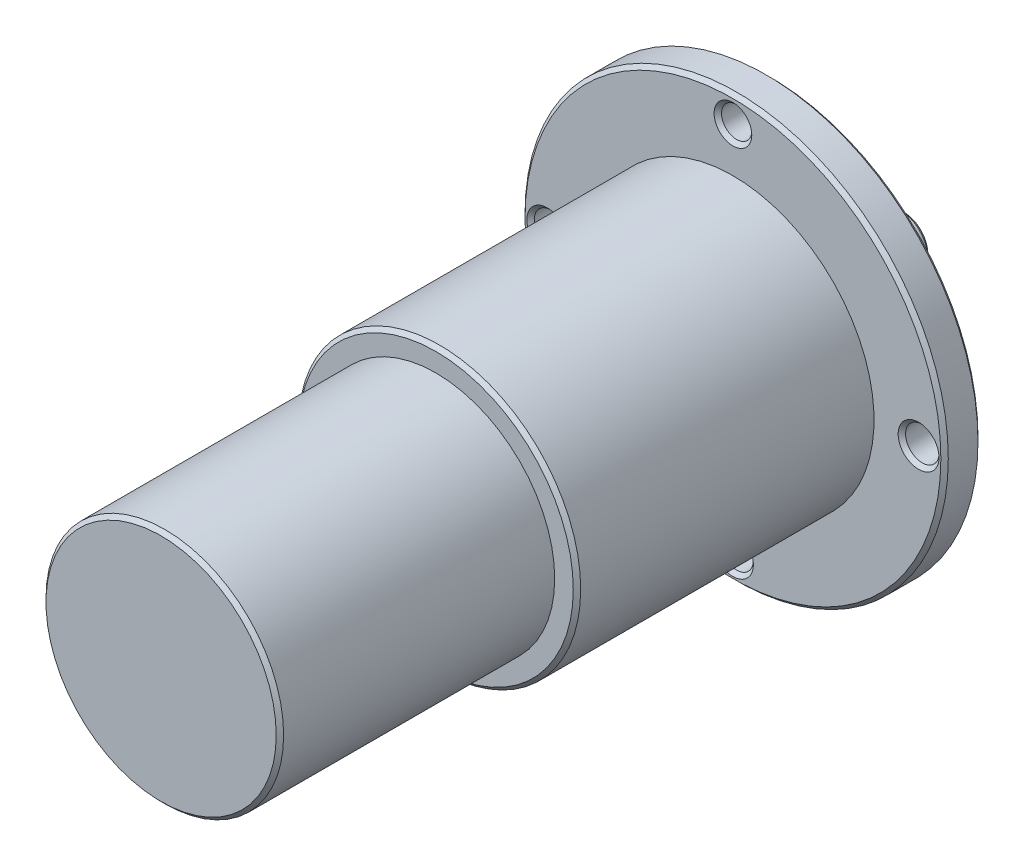
ISO-10303-21;
HEADER;
FILE_DESCRIPTION(('STEP AP214'),'2;1');
FILE_NAME('part.step','',(''),(''),'','','');
FILE_SCHEMA(('AUTOMOTIVE_DESIGN { 1 0 10303 214 1 1 1 1 }'));
ENDSEC;
DATA;
#1=APPLICATION_CONTEXT('core data for automotive mechanical design processes');
#2=APPLICATION_PROTOCOL_DEFINITION('international standard','automotive_design',2000,#1);
#3=PRODUCT_CONTEXT('',#1,'mechanical');
#4=PRODUCT('Part','Part','',(#3));
#5=PRODUCT_RELATED_PRODUCT_CATEGORY('part','',(#4));
#6=PRODUCT_DEFINITION_FORMATION('','',#4);
#7=PRODUCT_DEFINITION_CONTEXT('part definition',#1,'design');
#8=PRODUCT_DEFINITION('design','',#6,#7);
#9=PRODUCT_DEFINITION_SHAPE('','',#8);
#10=(LENGTH_UNIT() NAMED_UNIT(*) SI_UNIT(.MILLI.,.METRE.));
#11=(NAMED_UNIT(*) PLANE_ANGLE_UNIT() SI_UNIT($,.RADIAN.));
#12=(NAMED_UNIT(*) SI_UNIT($,.STERADIAN.) SOLID_ANGLE_UNIT());
#13=UNCERTAINTY_MEASURE_WITH_UNIT(LENGTH_MEASURE(1.E-05),#10,'distance_accuracy_value','');
#14=(GEOMETRIC_REPRESENTATION_CONTEXT(3) GLOBAL_UNCERTAINTY_ASSIGNED_CONTEXT((#13)) GLOBAL_UNIT_ASSIGNED_CONTEXT((#10,
#11,#12)) REPRESENTATION_CONTEXT('',''));
#15=CARTESIAN_POINT('',(0.,0.,0.));
#16=DIRECTION('',(0.,0.,1.));
#17=DIRECTION('',(1.,0.,0.));
#18=AXIS2_PLACEMENT_3D('',#15,#16,#17);
#19=CARTESIAN_POINT('',(-45.626724137931,0.,75.3655172413793));
#20=DIRECTION('',(0.,0.,1.));
#21=DIRECTION('',(1.,0.,0.));
#22=AXIS2_PLACEMENT_3D('',#19,#20,#21);
#23=PLANE('',#22);
#24=CARTESIAN_POINT('',(-29.626724137931,0.,75.3655172413793));
#25=DIRECTION('',(0.,0.,1.));
#26=DIRECTION('',(1.,0.,0.));
#27=AXIS2_PLACEMENT_3D('',#24,#25,#26);
#28=CIRCLE('',#27,15.5);
#29=CARTESIAN_POINT('',(-14.126724137931,0.,75.3655172413793));
#30=VERTEX_POINT('',#29);
#31=EDGE_CURVE('E40',#30,#30,#28,.T.);
#32=ORIENTED_EDGE('',*,*,#31,.T.);
#33=EDGE_LOOP('',(#32));
#34=FACE_BOUND('',#33,.T.);
#35=ADVANCED_FACE('F29',(#34),#23,.T.);
#36=CARTESIAN_POINT('',(-29.626724137931,0.,-29.8531609195402));
#37=DIRECTION('',(0.,0.,-1.));
#38=DIRECTION('',(-1.,0.,0.));
#39=AXIS2_PLACEMENT_3D('',#36,#37,#38);
#40=CYLINDRICAL_SURFACE('',#39,16.);
#41=CARTESIAN_POINT('',(-29.626724137931,0.,74.8655172413793));
#42=DIRECTION('',(0.,0.,1.));
#43=DIRECTION('',(1.,0.,0.));
#44=AXIS2_PLACEMENT_3D('',#41,#42,#43);
#45=CIRCLE('',#44,16.);
#46=CARTESIAN_POINT('',(-13.626724137931,0.,74.8655172413793));
#47=VERTEX_POINT('',#46);
#48=EDGE_CURVE('E44',#47,#47,#45,.F.);
#49=ORIENTED_EDGE('',*,*,#48,.T.);
#50=EDGE_LOOP('',(#49));
#51=FACE_BOUND('',#50,.T.);
#52=CARTESIAN_POINT('',(-29.626724137931,0.,38.3655172413793));
#53=DIRECTION('',(0.,0.,-1.));
#54=DIRECTION('',(-1.,0.,0.));
#55=AXIS2_PLACEMENT_3D('',#52,#53,#54);
#56=CIRCLE('',#55,16.);
#57=CARTESIAN_POINT('',(-45.626724137931,0.,38.3655172413793));
#58=VERTEX_POINT('',#57);
#59=EDGE_CURVE('E121',#58,#58,#56,.T.);
#60=ORIENTED_EDGE('',*,*,#59,.F.);
#61=EDGE_LOOP('',(#60));
#62=FACE_BOUND('',#61,.T.);
#63=ADVANCED_FACE('F152',(#51,#62),#40,.T.);
#64=CARTESIAN_POINT('',(-48.626724137931,0.,38.3655172413793));
#65=DIRECTION('',(0.,0.,1.));
#66=DIRECTION('',(1.,0.,0.));
#67=AXIS2_PLACEMENT_3D('',#64,#65,#66);
#68=PLANE('',#67);
#69=CARTESIAN_POINT('',(-29.626724137931,0.,38.3655172413793));
#70=DIRECTION('',(0.,0.,1.));
#71=DIRECTION('',(1.,0.,0.));
#72=AXIS2_PLACEMENT_3D('',#69,#70,#71);
#73=CIRCLE('',#72,18.5);
#74=CARTESIAN_POINT('',(-11.126724137931,0.,38.3655172413793));
#75=VERTEX_POINT('',#74);
#76=EDGE_CURVE('E10',#75,#75,#73,.T.);
#77=ORIENTED_EDGE('',*,*,#76,.T.);
#78=EDGE_LOOP('',(#77));
#79=FACE_BOUND('',#78,.T.);
#80=ORIENTED_EDGE('',*,*,#59,.T.);
#81=EDGE_LOOP('',(#80));
#82=FACE_BOUND('',#81,.T.);
#83=ADVANCED_FACE('F158',(#79,#82),#68,.T.);
#84=CARTESIAN_POINT('',(-29.626724137931,0.,-29.8531609195402));
#85=DIRECTION('',(0.,0.,-1.));
#86=DIRECTION('',(-1.,0.,0.));
#87=AXIS2_PLACEMENT_3D('',#84,#85,#86);
#88=CYLINDRICAL_SURFACE('',#87,19.);
#89=CARTESIAN_POINT('',(-29.626724137931,0.,37.8655172413793));
#90=DIRECTION('',(0.,0.,1.));
#91=DIRECTION('',(1.,0.,0.));
#92=AXIS2_PLACEMENT_3D('',#89,#90,#91);
#93=CIRCLE('',#92,19.);
#94=CARTESIAN_POINT('',(-10.626724137931,0.,37.8655172413793));
#95=VERTEX_POINT('',#94);
#96=EDGE_CURVE('E36',#95,#95,#93,.F.);
#97=ORIENTED_EDGE('',*,*,#96,.T.);
#98=EDGE_LOOP('',(#97));
#99=FACE_BOUND('',#98,.T.);
#100=CARTESIAN_POINT('',(-29.626724137931,0.,-1.63448275862068));
#101=DIRECTION('',(0.,0.,-1.));
#102=DIRECTION('',(-1.,0.,0.));
#103=AXIS2_PLACEMENT_3D('',#100,#101,#102);
#104=CIRCLE('',#103,19.);
#105=CARTESIAN_POINT('',(-48.626724137931,0.,-1.63448275862068));
#106=VERTEX_POINT('',#105);
#107=EDGE_CURVE('E124',#106,#106,#104,.T.);
#108=ORIENTED_EDGE('',*,*,#107,.F.);
#109=EDGE_LOOP('',(#108));
#110=FACE_BOUND('',#109,.T.);
#111=ADVANCED_FACE('F225',(#99,#110),#88,.T.);
#112=CARTESIAN_POINT('',(-58.126724137931,0.,-1.63448275862068));
#113=DIRECTION('',(0.,0.,1.));
#114=DIRECTION('',(1.,0.,0.));
#115=AXIS2_PLACEMENT_3D('',#112,#113,#114);
#116=PLANE('',#115);
#117=CARTESIAN_POINT('',(-54.626724137931,0.,-1.63448275862068));
#118=DIRECTION('',(0.,0.,1.));
#119=DIRECTION('',(1.,0.,0.));
#120=AXIS2_PLACEMENT_3D('',#117,#118,#119);
#121=CIRCLE('',#120,2.74999999999999);
#122=CARTESIAN_POINT('',(-51.876724137931,0.,-1.63448275862068));
#123=VERTEX_POINT('',#122);
#124=EDGE_CURVE('E100',#123,#123,#121,.F.);
#125=ORIENTED_EDGE('',*,*,#124,.T.);
#126=EDGE_LOOP('',(#125));
#127=FACE_BOUND('',#126,.T.);
#128=CARTESIAN_POINT('',(-4.62672413793103,0.,-1.63448275862068));
#129=DIRECTION('',(0.,0.,1.));
#130=DIRECTION('',(1.,0.,0.));
#131=AXIS2_PLACEMENT_3D('',#128,#129,#130);
#132=CIRCLE('',#131,2.74999999999999);
#133=CARTESIAN_POINT('',(-1.87672413793104,0.,-1.63448275862068));
#134=VERTEX_POINT('',#133);
#135=EDGE_CURVE('E103',#134,#134,#132,.F.);
#136=ORIENTED_EDGE('',*,*,#135,.T.);
#137=EDGE_LOOP('',(#136));
#138=FACE_BOUND('',#137,.T.);
#139=CARTESIAN_POINT('',(-29.626724137931,25.,-1.63448275862068));
#140=DIRECTION('',(0.,0.,1.));
#141=DIRECTION('',(1.,0.,0.));
#142=AXIS2_PLACEMENT_3D('',#139,#140,#141);
#143=CIRCLE('',#142,2.53684922244777);
#144=CARTESIAN_POINT('',(-27.0898749154833,25.,-1.63448275862068));
#145=VERTEX_POINT('',#144);
#146=EDGE_CURVE('E106',#145,#145,#143,.F.);
#147=ORIENTED_EDGE('',*,*,#146,.T.);
#148=EDGE_LOOP('',(#147));
#149=FACE_BOUND('',#148,.T.);
#150=CARTESIAN_POINT('',(-29.626724137931,-25.,-1.63448275862068));
#151=DIRECTION('',(0.,0.,1.));
#152=DIRECTION('',(1.,0.,0.));
#153=AXIS2_PLACEMENT_3D('',#150,#151,#152);
#154=CIRCLE('',#153,2.74999999999998);
#155=CARTESIAN_POINT('',(-26.876724137931,-25.,-1.63448275862068));
#156=VERTEX_POINT('',#155);
#157=EDGE_CURVE('E109',#156,#156,#154,.F.);
#158=ORIENTED_EDGE('',*,*,#157,.T.);
#159=EDGE_LOOP('',(#158));
#160=FACE_BOUND('',#159,.T.);
#161=CARTESIAN_POINT('',(-29.626724137931,0.,-1.63448275862068));
#162=DIRECTION('',(0.,0.,1.));
#163=DIRECTION('',(1.,0.,0.));
#164=AXIS2_PLACEMENT_3D('',#161,#162,#163);
#165=CIRCLE('',#164,28.);
#166=CARTESIAN_POINT('',(-1.62672413793104,0.,-1.63448275862068));
#167=VERTEX_POINT('',#166);
#168=EDGE_CURVE('E112',#167,#167,#165,.T.);
#169=ORIENTED_EDGE('',*,*,#168,.T.);
#170=EDGE_LOOP('',(#169));
#171=FACE_BOUND('',#170,.T.);
#172=ORIENTED_EDGE('',*,*,#107,.T.);
#173=EDGE_LOOP('',(#172));
#174=FACE_BOUND('',#173,.T.);
#175=ADVANCED_FACE('F229',(#127,#138,#149,#160,#171,#174),#116,.T.);
#176=CARTESIAN_POINT('',(-29.626724137931,0.,-29.8531609195402));
#177=DIRECTION('',(0.,0.,-1.));
#178=DIRECTION('',(-1.,0.,0.));
#179=AXIS2_PLACEMENT_3D('',#176,#177,#178);
#180=CYLINDRICAL_SURFACE('',#179,28.5);
#181=CARTESIAN_POINT('',(-29.626724137931,0.,-6.13448275862067));
#182=DIRECTION('',(0.,0.,-1.));
#183=DIRECTION('',(-1.,0.,0.));
#184=AXIS2_PLACEMENT_3D('',#181,#182,#183);
#185=CIRCLE('',#184,28.5);
#186=CARTESIAN_POINT('',(-58.126724137931,0.,-6.13448275862067));
#187=VERTEX_POINT('',#186);
#188=EDGE_CURVE('E49',#187,#187,#185,.F.);
#189=ORIENTED_EDGE('',*,*,#188,.T.);
#190=EDGE_LOOP('',(#189));
#191=FACE_BOUND('',#190,.T.);
#192=CARTESIAN_POINT('',(-29.626724137931,0.,-2.13448275862068));
#193=DIRECTION('',(0.,0.,1.));
#194=DIRECTION('',(1.,0.,0.));
#195=AXIS2_PLACEMENT_3D('',#192,#193,#194);
#196=CIRCLE('',#195,28.5);
#197=CARTESIAN_POINT('',(-1.12672413793103,0.,-2.13448275862068));
#198=VERTEX_POINT('',#197);
#199=EDGE_CURVE('E52',#198,#198,#196,.F.);
#200=ORIENTED_EDGE('',*,*,#199,.T.);
#201=EDGE_LOOP('',(#200));
#202=FACE_BOUND('',#201,.T.);
#203=ADVANCED_FACE('F234',(#191,#202),#180,.T.);
#204=CARTESIAN_POINT('',(-42.126724137931,0.,-6.63448275862068));
#205=DIRECTION('',(0.,0.,-1.));
#206=DIRECTION('',(-1.,0.,0.));
#207=AXIS2_PLACEMENT_3D('',#204,#205,#206);
#208=PLANE('',#207);
#209=CARTESIAN_POINT('',(-29.626724137931,25.,-6.63448275862068));
#210=DIRECTION('',(0.,0.,-1.));
#211=DIRECTION('',(-1.,0.,0.));
#212=AXIS2_PLACEMENT_3D('',#209,#210,#211);
#213=CIRCLE('',#212,2.53684922244778);
#214=CARTESIAN_POINT('',(-32.1635733603788,25.,-6.63448275862068));
#215=VERTEX_POINT('',#214);
#216=EDGE_CURVE('E67',#215,#215,#213,.F.);
#217=ORIENTED_EDGE('',*,*,#216,.T.);
#218=EDGE_LOOP('',(#217));
#219=FACE_BOUND('',#218,.T.);
#220=CARTESIAN_POINT('',(-4.62672413793103,0.,-6.63448275862068));
#221=DIRECTION('',(0.,0.,-1.));
#222=DIRECTION('',(-1.,0.,0.));
#223=AXIS2_PLACEMENT_3D('',#220,#221,#222);
#224=CIRCLE('',#223,2.74999999999999);
#225=CARTESIAN_POINT('',(-7.37672413793102,0.,-6.63448275862068));
#226=VERTEX_POINT('',#225);
#227=EDGE_CURVE('E70',#226,#226,#224,.F.);
#228=ORIENTED_EDGE('',*,*,#227,.T.);
#229=EDGE_LOOP('',(#228));
#230=FACE_BOUND('',#229,.T.);
#231=CARTESIAN_POINT('',(-29.626724137931,-25.,-6.63448275862068));
#232=DIRECTION('',(0.,0.,-1.));
#233=DIRECTION('',(-1.,0.,0.));
#234=AXIS2_PLACEMENT_3D('',#231,#232,#233);
#235=CIRCLE('',#234,2.74999999999999);
#236=CARTESIAN_POINT('',(-32.376724137931,-25.,-6.63448275862068));
#237=VERTEX_POINT('',#236);
#238=EDGE_CURVE('E73',#237,#237,#235,.F.);
#239=ORIENTED_EDGE('',*,*,#238,.T.);
#240=EDGE_LOOP('',(#239));
#241=FACE_BOUND('',#240,.T.);
#242=CARTESIAN_POINT('',(-54.626724137931,0.,-6.63448275862068));
#243=DIRECTION('',(0.,0.,-1.));
#244=DIRECTION('',(-1.,0.,0.));
#245=AXIS2_PLACEMENT_3D('',#242,#243,#244);
#246=CIRCLE('',#245,2.74999999999999);
#247=CARTESIAN_POINT('',(-57.376724137931,0.,-6.63448275862068));
#248=VERTEX_POINT('',#247);
#249=EDGE_CURVE('E76',#248,#248,#246,.F.);
#250=ORIENTED_EDGE('',*,*,#249,.T.);
#251=EDGE_LOOP('',(#250));
#252=FACE_BOUND('',#251,.T.);
#253=CARTESIAN_POINT('',(-29.626724137931,0.,-6.63448275862068));
#254=DIRECTION('',(0.,0.,-1.));
#255=DIRECTION('',(-1.,0.,0.));
#256=AXIS2_PLACEMENT_3D('',#253,#254,#255);
#257=CIRCLE('',#256,28.);
#258=CARTESIAN_POINT('',(-57.626724137931,0.,-6.63448275862068));
#259=VERTEX_POINT('',#258);
#260=EDGE_CURVE('E79',#259,#259,#257,.T.);
#261=ORIENTED_EDGE('',*,*,#260,.T.);
#262=EDGE_LOOP('',(#261));
#263=FACE_BOUND('',#262,.T.);
#264=CARTESIAN_POINT('',(-29.626724137931,0.,-6.63448275862068));
#265=DIRECTION('',(0.,0.,-1.));
#266=DIRECTION('',(-1.,0.,0.));
#267=AXIS2_PLACEMENT_3D('',#264,#265,#266);
#268=CIRCLE('',#267,12.5);
#269=CARTESIAN_POINT('',(-42.126724137931,0.,-6.63448275862068));
#270=VERTEX_POINT('',#269);
#271=EDGE_CURVE('E127',#270,#270,#268,.T.);
#272=ORIENTED_EDGE('',*,*,#271,.F.);
#273=EDGE_LOOP('',(#272));
#274=FACE_BOUND('',#273,.T.);
#275=ADVANCED_FACE('F148',(#219,#230,#241,#252,#263,#274),#208,.T.);
#276=CARTESIAN_POINT('',(-29.626724137931,0.,-29.8531609195402));
#277=DIRECTION('',(0.,0.,-1.));
#278=DIRECTION('',(-1.,0.,0.));
#279=AXIS2_PLACEMENT_3D('',#276,#277,#278);
#280=CYLINDRICAL_SURFACE('',#279,12.5);
#281=CARTESIAN_POINT('',(-29.626724137931,0.,-9.13448275862069));
#282=DIRECTION('',(0.,0.,-1.));
#283=DIRECTION('',(-1.,0.,0.));
#284=AXIS2_PLACEMENT_3D('',#281,#282,#283);
#285=CIRCLE('',#284,12.5);
#286=CARTESIAN_POINT('',(-42.126724137931,0.,-9.13448275862069));
#287=VERTEX_POINT('',#286);
#288=EDGE_CURVE('E61',#287,#287,#285,.F.);
#289=ORIENTED_EDGE('',*,*,#288,.T.);
#290=EDGE_LOOP('',(#289));
#291=FACE_BOUND('',#290,.T.);
#292=ORIENTED_EDGE('',*,*,#271,.T.);
#293=EDGE_LOOP('',(#292));
#294=FACE_BOUND('',#293,.T.);
#295=ADVANCED_FACE('F138',(#291,#294),#280,.T.);
#296=CARTESIAN_POINT('',(-33.376724137931,0.,-9.63448275862068));
#297=DIRECTION('',(0.,0.,-1.));
#298=DIRECTION('',(-1.,0.,0.));
#299=AXIS2_PLACEMENT_3D('',#296,#297,#298);
#300=PLANE('',#299);
#301=CARTESIAN_POINT('',(-29.626724137931,0.,-9.63448275862068));
#302=DIRECTION('',(0.,0.,-1.));
#303=DIRECTION('',(-1.,0.,0.));
#304=AXIS2_PLACEMENT_3D('',#301,#302,#303);
#305=CIRCLE('',#304,12.);
#306=CARTESIAN_POINT('',(-41.626724137931,0.,-9.63448275862068));
#307=VERTEX_POINT('',#306);
#308=EDGE_CURVE('E64',#307,#307,#305,.T.);
#309=ORIENTED_EDGE('',*,*,#308,.T.);
#310=EDGE_LOOP('',(#309));
#311=FACE_BOUND('',#310,.T.);
#312=CARTESIAN_POINT('',(-29.626724137931,0.,-9.63448275862068));
#313=DIRECTION('',(0.,0.,-1.));
#314=DIRECTION('',(-1.,0.,0.));
#315=AXIS2_PLACEMENT_3D('',#312,#313,#314);
#316=CIRCLE('',#315,3.75000000000001);
#317=CARTESIAN_POINT('',(-33.376724137931,0.,-9.63448275862068));
#318=VERTEX_POINT('',#317);
#319=EDGE_CURVE('E130',#318,#318,#316,.T.);
#320=ORIENTED_EDGE('',*,*,#319,.F.);
#321=EDGE_LOOP('',(#320));
#322=FACE_BOUND('',#321,.T.);
#323=ADVANCED_FACE('F136',(#311,#322),#300,.T.);
#324=CARTESIAN_POINT('',(-29.626724137931,0.,-29.8531609195402));
#325=DIRECTION('',(0.,0.,-1.));
#326=DIRECTION('',(-1.,0.,0.));
#327=AXIS2_PLACEMENT_3D('',#324,#325,#326);
#328=CYLINDRICAL_SURFACE('',#327,3.75000000000001);
#329=CARTESIAN_POINT('',(-29.626724137931,0.,-24.1344827586207));
#330=DIRECTION('',(0.,0.,-1.));
#331=DIRECTION('',(-1.,0.,0.));
#332=AXIS2_PLACEMENT_3D('',#329,#330,#331);
#333=CIRCLE('',#332,3.75000000000001);
#334=CARTESIAN_POINT('',(-33.376724137931,0.,-24.1344827586207));
#335=VERTEX_POINT('',#334);
#336=EDGE_CURVE('E55',#335,#335,#333,.F.);
#337=ORIENTED_EDGE('',*,*,#336,.T.);
#338=EDGE_LOOP('',(#337));
#339=FACE_BOUND('',#338,.T.);
#340=ORIENTED_EDGE('',*,*,#319,.T.);
#341=EDGE_LOOP('',(#340));
#342=FACE_BOUND('',#341,.T.);
#343=ADVANCED_FACE('F134',(#339,#342),#328,.T.);
#344=CARTESIAN_POINT('',(-29.626724137931,0.,-24.6344827586207));
#345=DIRECTION('',(0.,0.,-1.));
#346=DIRECTION('',(-1.,0.,0.));
#347=AXIS2_PLACEMENT_3D('',#344,#345,#346);
#348=PLANE('',#347);
#349=CARTESIAN_POINT('',(-29.626724137931,0.,-24.6344827586207));
#350=DIRECTION('',(0.,0.,-1.));
#351=DIRECTION('',(-1.,0.,0.));
#352=AXIS2_PLACEMENT_3D('',#349,#350,#351);
#353=CIRCLE('',#352,3.25000000000003);
#354=CARTESIAN_POINT('',(-32.8767241379311,0.,-24.6344827586207));
#355=VERTEX_POINT('',#354);
#356=EDGE_CURVE('E58',#355,#355,#353,.T.);
#357=ORIENTED_EDGE('',*,*,#356,.T.);
#358=EDGE_LOOP('',(#357));
#359=FACE_BOUND('',#358,.T.);
#360=ADVANCED_FACE('F145',(#359),#348,.T.);
#361=CARTESIAN_POINT('',(-4.62672413793103,0.,-11.6344827586207));
#362=DIRECTION('',(0.,0.,1.));
#363=DIRECTION('',(1.,0.,0.));
#364=AXIS2_PLACEMENT_3D('',#361,#362,#363);
#365=CYLINDRICAL_SURFACE('',#364,2.25);
#366=CARTESIAN_POINT('',(-4.62672413793103,0.,-2.13448275862066));
#367=DIRECTION('',(0.,0.,1.));
#368=DIRECTION('',(1.,0.,0.));
#369=AXIS2_PLACEMENT_3D('',#366,#367,#368);
#370=CIRCLE('',#369,2.25);
#371=CARTESIAN_POINT('',(-2.37672413793103,0.,-2.13448275862066));
#372=VERTEX_POINT('',#371);
#373=EDGE_CURVE('E94',#372,#372,#370,.T.);
#374=ORIENTED_EDGE('',*,*,#373,.T.);
#375=EDGE_LOOP('',(#374));
#376=FACE_BOUND('',#375,.T.);
#377=CARTESIAN_POINT('',(-4.62672413793103,0.,-6.1344827586207));
#378=DIRECTION('',(0.,0.,-1.));
#379=DIRECTION('',(-1.,0.,0.));
#380=AXIS2_PLACEMENT_3D('',#377,#378,#379);
#381=CIRCLE('',#380,2.25);
#382=CARTESIAN_POINT('',(-6.87672413793103,0.,-6.1344827586207));
#383=VERTEX_POINT('',#382);
#384=EDGE_CURVE('E97',#383,#383,#381,.T.);
#385=ORIENTED_EDGE('',*,*,#384,.T.);
#386=EDGE_LOOP('',(#385));
#387=FACE_BOUND('',#386,.T.);
#388=ADVANCED_FACE('F270',(#376,#387),#365,.F.);
#389=CARTESIAN_POINT('',(-29.626724137931,25.,-11.6344827586207));
#390=DIRECTION('',(0.,0.,1.));
#391=DIRECTION('',(1.,0.,0.));
#392=AXIS2_PLACEMENT_3D('',#389,#390,#391);
#393=CYLINDRICAL_SURFACE('',#392,2.03684922244779);
#394=CARTESIAN_POINT('',(-29.626724137931,25.,-2.13448275862067));
#395=DIRECTION('',(0.,0.,1.));
#396=DIRECTION('',(1.,0.,0.));
#397=AXIS2_PLACEMENT_3D('',#394,#395,#396);
#398=CIRCLE('',#397,2.03684922244779);
#399=CARTESIAN_POINT('',(-27.5898749154832,25.,-2.13448275862067));
#400=VERTEX_POINT('',#399);
#401=EDGE_CURVE('E88',#400,#400,#398,.T.);
#402=ORIENTED_EDGE('',*,*,#401,.T.);
#403=EDGE_LOOP('',(#402));
#404=FACE_BOUND('',#403,.T.);
#405=CARTESIAN_POINT('',(-29.626724137931,25.,-6.13448275862068));
#406=DIRECTION('',(0.,0.,-1.));
#407=DIRECTION('',(-1.,0.,0.));
#408=AXIS2_PLACEMENT_3D('',#405,#406,#407);
#409=CIRCLE('',#408,2.03684922244779);
#410=CARTESIAN_POINT('',(-31.6635733603788,25.,-6.13448275862068));
#411=VERTEX_POINT('',#410);
#412=EDGE_CURVE('E91',#411,#411,#409,.T.);
#413=ORIENTED_EDGE('',*,*,#412,.T.);
#414=EDGE_LOOP('',(#413));
#415=FACE_BOUND('',#414,.T.);
#416=ADVANCED_FACE('F261',(#404,#415),#393,.F.);
#417=CARTESIAN_POINT('',(-54.626724137931,0.,-11.6344827586207));
#418=DIRECTION('',(0.,0.,1.));
#419=DIRECTION('',(1.,0.,0.));
#420=AXIS2_PLACEMENT_3D('',#417,#418,#419);
#421=CYLINDRICAL_SURFACE('',#420,2.25);
#422=CARTESIAN_POINT('',(-54.626724137931,0.,-2.13448275862066));
#423=DIRECTION('',(0.,0.,1.));
#424=DIRECTION('',(1.,0.,0.));
#425=AXIS2_PLACEMENT_3D('',#422,#423,#424);
#426=CIRCLE('',#425,2.25);
#427=CARTESIAN_POINT('',(-52.376724137931,0.,-2.13448275862066));
#428=VERTEX_POINT('',#427);
#429=EDGE_CURVE('E115',#428,#428,#426,.T.);
#430=ORIENTED_EDGE('',*,*,#429,.T.);
#431=EDGE_LOOP('',(#430));
#432=FACE_BOUND('',#431,.T.);
#433=CARTESIAN_POINT('',(-54.626724137931,0.,-6.1344827586207));
#434=DIRECTION('',(0.,0.,-1.));
#435=DIRECTION('',(-1.,0.,0.));
#436=AXIS2_PLACEMENT_3D('',#433,#434,#435);
#437=CIRCLE('',#436,2.25);
#438=CARTESIAN_POINT('',(-56.876724137931,0.,-6.1344827586207));
#439=VERTEX_POINT('',#438);
#440=EDGE_CURVE('E118',#439,#439,#437,.T.);
#441=ORIENTED_EDGE('',*,*,#440,.T.);
#442=EDGE_LOOP('',(#441));
#443=FACE_BOUND('',#442,.T.);
#444=ADVANCED_FACE('F259',(#432,#443),#421,.F.);
#445=CARTESIAN_POINT('',(-29.626724137931,-25.,-11.6344827586207));
#446=DIRECTION('',(0.,0.,1.));
#447=DIRECTION('',(1.,0.,0.));
#448=AXIS2_PLACEMENT_3D('',#445,#446,#447);
#449=CYLINDRICAL_SURFACE('',#448,2.25);
#450=CARTESIAN_POINT('',(-29.626724137931,-25.,-2.13448275862066));
#451=DIRECTION('',(0.,0.,1.));
#452=DIRECTION('',(1.,0.,0.));
#453=AXIS2_PLACEMENT_3D('',#450,#451,#452);
#454=CIRCLE('',#453,2.25);
#455=CARTESIAN_POINT('',(-27.376724137931,-25.,-2.13448275862066));
#456=VERTEX_POINT('',#455);
#457=EDGE_CURVE('E82',#456,#456,#454,.T.);
#458=ORIENTED_EDGE('',*,*,#457,.T.);
#459=EDGE_LOOP('',(#458));
#460=FACE_BOUND('',#459,.T.);
#461=CARTESIAN_POINT('',(-29.626724137931,-25.,-6.13448275862069));
#462=DIRECTION('',(0.,0.,-1.));
#463=DIRECTION('',(-1.,0.,0.));
#464=AXIS2_PLACEMENT_3D('',#461,#462,#463);
#465=CIRCLE('',#464,2.25);
#466=CARTESIAN_POINT('',(-31.876724137931,-25.,-6.13448275862069));
#467=VERTEX_POINT('',#466);
#468=EDGE_CURVE('E85',#467,#467,#465,.T.);
#469=ORIENTED_EDGE('',*,*,#468,.T.);
#470=EDGE_LOOP('',(#469));
#471=FACE_BOUND('',#470,.T.);
#472=ADVANCED_FACE('F167',(#460,#471),#449,.F.);
#473=CARTESIAN_POINT('',(-54.626724137931,0.,-2.13448275862066));
#474=DIRECTION('',(0.,0.,1.));
#475=DIRECTION('',(1.,0.,0.));
#476=AXIS2_PLACEMENT_3D('',#473,#474,#475);
#477=CONICAL_SURFACE('',#476,2.25,0.785398163397455);
#478=ORIENTED_EDGE('',*,*,#124,.F.);
#479=EDGE_LOOP('',(#478));
#480=FACE_BOUND('',#479,.T.);
#481=ORIENTED_EDGE('',*,*,#429,.F.);
#482=EDGE_LOOP('',(#481));
#483=FACE_BOUND('',#482,.T.);
#484=ADVANCED_FACE('F163',(#480,#483),#477,.F.);
#485=CARTESIAN_POINT('',(-4.62672413793103,0.,-2.13448275862066));
#486=DIRECTION('',(0.,0.,1.));
#487=DIRECTION('',(1.,0.,0.));
#488=AXIS2_PLACEMENT_3D('',#485,#486,#487);
#489=CONICAL_SURFACE('',#488,2.25,0.785398163397454);
#490=ORIENTED_EDGE('',*,*,#135,.F.);
#491=EDGE_LOOP('',(#490));
#492=FACE_BOUND('',#491,.T.);
#493=ORIENTED_EDGE('',*,*,#373,.F.);
#494=EDGE_LOOP('',(#493));
#495=FACE_BOUND('',#494,.T.);
#496=ADVANCED_FACE('F166',(#492,#495),#489,.F.);
#497=CARTESIAN_POINT('',(-29.626724137931,25.,-2.13448275862067));
#498=DIRECTION('',(0.,0.,1.));
#499=DIRECTION('',(1.,0.,0.));
#500=AXIS2_PLACEMENT_3D('',#497,#498,#499);
#501=CONICAL_SURFACE('',#500,2.03684922244779,0.785398163397439);
#502=ORIENTED_EDGE('',*,*,#146,.F.);
#503=EDGE_LOOP('',(#502));
#504=FACE_BOUND('',#503,.T.);
#505=ORIENTED_EDGE('',*,*,#401,.F.);
#506=EDGE_LOOP('',(#505));
#507=FACE_BOUND('',#506,.T.);
#508=ADVANCED_FACE('F171',(#504,#507),#501,.F.);
#509=CARTESIAN_POINT('',(-29.626724137931,-25.,-2.13448275862066));
#510=DIRECTION('',(0.,0.,1.));
#511=DIRECTION('',(1.,0.,0.));
#512=AXIS2_PLACEMENT_3D('',#509,#510,#511);
#513=CONICAL_SURFACE('',#512,2.25,0.785398163397452);
#514=ORIENTED_EDGE('',*,*,#157,.F.);
#515=EDGE_LOOP('',(#514));
#516=FACE_BOUND('',#515,.T.);
#517=ORIENTED_EDGE('',*,*,#457,.F.);
#518=EDGE_LOOP('',(#517));
#519=FACE_BOUND('',#518,.T.);
#520=ADVANCED_FACE('F175',(#516,#519),#513,.F.);
#521=CARTESIAN_POINT('',(-29.626724137931,25.,-6.13448275862068));
#522=DIRECTION('',(0.,0.,-1.));
#523=DIRECTION('',(-1.,0.,0.));
#524=AXIS2_PLACEMENT_3D('',#521,#522,#523);
#525=CONICAL_SURFACE('',#524,2.03684922244779,0.785398163397442);
#526=ORIENTED_EDGE('',*,*,#216,.F.);
#527=EDGE_LOOP('',(#526));
#528=FACE_BOUND('',#527,.T.);
#529=ORIENTED_EDGE('',*,*,#412,.F.);
#530=EDGE_LOOP('',(#529));
#531=FACE_BOUND('',#530,.T.);
#532=ADVANCED_FACE('F179',(#528,#531),#525,.F.);
#533=CARTESIAN_POINT('',(-4.62672413793103,0.,-6.1344827586207));
#534=DIRECTION('',(0.,0.,-1.));
#535=DIRECTION('',(-1.,0.,0.));
#536=AXIS2_PLACEMENT_3D('',#533,#534,#535);
#537=CONICAL_SURFACE('',#536,2.25,0.785398163397455);
#538=ORIENTED_EDGE('',*,*,#227,.F.);
#539=EDGE_LOOP('',(#538));
#540=FACE_BOUND('',#539,.T.);
#541=ORIENTED_EDGE('',*,*,#384,.F.);
#542=EDGE_LOOP('',(#541));
#543=FACE_BOUND('',#542,.T.);
#544=ADVANCED_FACE('F183',(#540,#543),#537,.F.);
#545=CARTESIAN_POINT('',(-29.626724137931,-25.,-6.13448275862069));
#546=DIRECTION('',(0.,0.,-1.));
#547=DIRECTION('',(-1.,0.,0.));
#548=AXIS2_PLACEMENT_3D('',#545,#546,#547);
#549=CONICAL_SURFACE('',#548,2.25,0.785398163397455);
#550=ORIENTED_EDGE('',*,*,#238,.F.);
#551=EDGE_LOOP('',(#550));
#552=FACE_BOUND('',#551,.T.);
#553=ORIENTED_EDGE('',*,*,#468,.F.);
#554=EDGE_LOOP('',(#553));
#555=FACE_BOUND('',#554,.T.);
#556=ADVANCED_FACE('F187',(#552,#555),#549,.F.);
#557=CARTESIAN_POINT('',(-54.626724137931,0.,-6.1344827586207));
#558=DIRECTION('',(0.,0.,-1.));
#559=DIRECTION('',(-1.,0.,0.));
#560=AXIS2_PLACEMENT_3D('',#557,#558,#559);
#561=CONICAL_SURFACE('',#560,2.25,0.785398163397455);
#562=ORIENTED_EDGE('',*,*,#249,.F.);
#563=EDGE_LOOP('',(#562));
#564=FACE_BOUND('',#563,.T.);
#565=ORIENTED_EDGE('',*,*,#440,.F.);
#566=EDGE_LOOP('',(#565));
#567=FACE_BOUND('',#566,.T.);
#568=ADVANCED_FACE('F191',(#564,#567),#561,.F.);
#569=CARTESIAN_POINT('',(-29.626724137931,0.,-9.63448275862068));
#570=DIRECTION('',(0.,0.,1.));
#571=DIRECTION('',(1.,0.,0.));
#572=AXIS2_PLACEMENT_3D('',#569,#570,#571);
#573=CONICAL_SURFACE('',#572,12.,0.785398163397445);
#574=ORIENTED_EDGE('',*,*,#288,.F.);
#575=EDGE_LOOP('',(#574));
#576=FACE_BOUND('',#575,.T.);
#577=ORIENTED_EDGE('',*,*,#308,.F.);
#578=EDGE_LOOP('',(#577));
#579=FACE_BOUND('',#578,.T.);
#580=ADVANCED_FACE('F195',(#576,#579),#573,.T.);
#581=CARTESIAN_POINT('',(-29.626724137931,0.,-24.6344827586207));
#582=DIRECTION('',(0.,0.,1.));
#583=DIRECTION('',(1.,0.,0.));
#584=AXIS2_PLACEMENT_3D('',#581,#582,#583);
#585=CONICAL_SURFACE('',#584,3.25000000000003,0.785398163397438);
#586=ORIENTED_EDGE('',*,*,#336,.F.);
#587=EDGE_LOOP('',(#586));
#588=FACE_BOUND('',#587,.T.);
#589=ORIENTED_EDGE('',*,*,#356,.F.);
#590=EDGE_LOOP('',(#589));
#591=FACE_BOUND('',#590,.T.);
#592=ADVANCED_FACE('F199',(#588,#591),#585,.T.);
#593=CARTESIAN_POINT('',(-29.626724137931,0.,-6.63448275862068));
#594=DIRECTION('',(0.,0.,1.));
#595=DIRECTION('',(1.,0.,0.));
#596=AXIS2_PLACEMENT_3D('',#593,#594,#595);
#597=CONICAL_SURFACE('',#596,28.,0.785398163397438);
#598=ORIENTED_EDGE('',*,*,#188,.F.);
#599=EDGE_LOOP('',(#598));
#600=FACE_BOUND('',#599,.T.);
#601=ORIENTED_EDGE('',*,*,#260,.F.);
#602=EDGE_LOOP('',(#601));
#603=FACE_BOUND('',#602,.T.);
#604=ADVANCED_FACE('F203',(#600,#603),#597,.T.);
#605=CARTESIAN_POINT('',(-29.626724137931,0.,-2.13448275862068));
#606=DIRECTION('',(0.,0.,-1.));
#607=DIRECTION('',(-1.,0.,0.));
#608=AXIS2_PLACEMENT_3D('',#605,#606,#607);
#609=CONICAL_SURFACE('',#608,28.5,0.785398163397448);
#610=ORIENTED_EDGE('',*,*,#168,.F.);
#611=EDGE_LOOP('',(#610));
#612=FACE_BOUND('',#611,.T.);
#613=ORIENTED_EDGE('',*,*,#199,.F.);
#614=EDGE_LOOP('',(#613));
#615=FACE_BOUND('',#614,.T.);
#616=ADVANCED_FACE('F207',(#612,#615),#609,.T.);
#617=CARTESIAN_POINT('',(-29.626724137931,0.,74.8655172413793));
#618=DIRECTION('',(0.,0.,-1.));
#619=DIRECTION('',(-1.,0.,0.));
#620=AXIS2_PLACEMENT_3D('',#617,#618,#619);
#621=CONICAL_SURFACE('',#620,16.,0.785398163397445);
#622=ORIENTED_EDGE('',*,*,#31,.F.);
#623=EDGE_LOOP('',(#622));
#624=FACE_BOUND('',#623,.T.);
#625=ORIENTED_EDGE('',*,*,#48,.F.);
#626=EDGE_LOOP('',(#625));
#627=FACE_BOUND('',#626,.T.);
#628=ADVANCED_FACE('F210',(#624,#627),#621,.T.);
#629=CARTESIAN_POINT('',(-29.626724137931,0.,37.8655172413793));
#630=DIRECTION('',(0.,0.,-1.));
#631=DIRECTION('',(-1.,0.,0.));
#632=AXIS2_PLACEMENT_3D('',#629,#630,#631);
#633=CONICAL_SURFACE('',#632,19.,0.785398163397448);
#634=ORIENTED_EDGE('',*,*,#76,.F.);
#635=EDGE_LOOP('',(#634));
#636=FACE_BOUND('',#635,.T.);
#637=ORIENTED_EDGE('',*,*,#96,.F.);
#638=EDGE_LOOP('',(#637));
#639=FACE_BOUND('',#638,.T.);
#640=ADVANCED_FACE('F31',(#636,#639),#633,.T.);
#641=CLOSED_SHELL('',(#35,#63,#83,#111,#175,#203,#275,#295,#323,#343,#360,#388,#416,#444,#472,
#484,#496,#508,#520,#532,#544,#556,#568,#580,#592,#604,#616,#628,#640));
#642=MANIFOLD_SOLID_BREP('B2',#641);
#643=ADVANCED_BREP_SHAPE_REPRESENTATION('',(#18,#642),#14);
#644=SHAPE_DEFINITION_REPRESENTATION(#9,#643);
ENDSEC;
END-ISO-10303-21;
